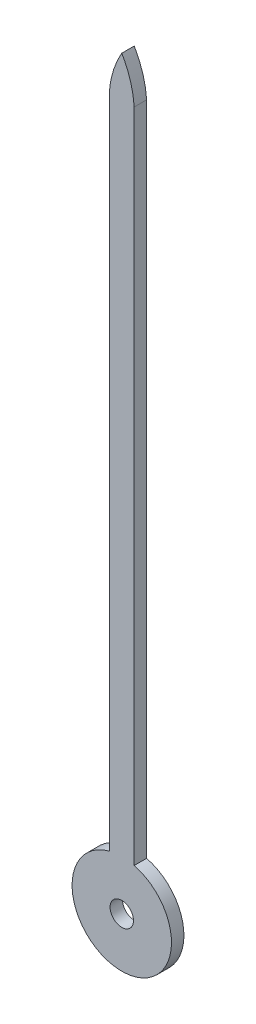
ISO-10303-21;
HEADER;
FILE_DESCRIPTION(('STEP AP214'),'2;1');
FILE_NAME('part.step','',(''),(''),'','','');
FILE_SCHEMA(('AUTOMOTIVE_DESIGN { 1 0 10303 214 1 1 1 1 }'));
ENDSEC;
DATA;
#1=APPLICATION_CONTEXT('core data for automotive mechanical design processes');
#2=APPLICATION_PROTOCOL_DEFINITION('international standard','automotive_design',2000,#1);
#3=PRODUCT_CONTEXT('',#1,'mechanical');
#4=PRODUCT('Part','Part','',(#3));
#5=PRODUCT_RELATED_PRODUCT_CATEGORY('part','',(#4));
#6=PRODUCT_DEFINITION_FORMATION('','',#4);
#7=PRODUCT_DEFINITION_CONTEXT('part definition',#1,'design');
#8=PRODUCT_DEFINITION('design','',#6,#7);
#9=PRODUCT_DEFINITION_SHAPE('','',#8);
#10=(LENGTH_UNIT() NAMED_UNIT(*) SI_UNIT(.MILLI.,.METRE.));
#11=(NAMED_UNIT(*) PLANE_ANGLE_UNIT() SI_UNIT($,.RADIAN.));
#12=(NAMED_UNIT(*) SI_UNIT($,.STERADIAN.) SOLID_ANGLE_UNIT());
#13=UNCERTAINTY_MEASURE_WITH_UNIT(LENGTH_MEASURE(1.E-05),#10,'distance_accuracy_value','');
#14=(GEOMETRIC_REPRESENTATION_CONTEXT(3) GLOBAL_UNCERTAINTY_ASSIGNED_CONTEXT((#13)) GLOBAL_UNIT_ASSIGNED_CONTEXT((#10,
#11,#12)) REPRESENTATION_CONTEXT('',''));
#15=CARTESIAN_POINT('',(0.,0.,0.));
#16=DIRECTION('',(0.,0.,1.));
#17=DIRECTION('',(1.,0.,0.));
#18=AXIS2_PLACEMENT_3D('',#15,#16,#17);
#19=CARTESIAN_POINT('',(1.03490462559106,87.645569604283,1.5));
#20=DIRECTION('',(0.,0.,1.));
#21=DIRECTION('',(1.,0.,0.));
#22=AXIS2_PLACEMENT_3D('',#19,#20,#21);
#23=PLANE('',#22);
#24=CARTESIAN_POINT('',(1.5,85.1251432363519,1.5));
#25=CARTESIAN_POINT('',(1.31980925118211,87.72856759039,1.5));
#26=CARTESIAN_POINT('',(0.,90.,1.5));
#27=B_SPLINE_CURVE_WITH_KNOTS('',2,(#24,#25,#26),.UNSPECIFIED.,.F.,.F.,(3,3),(0.,1.),.UNSPECIFIED.);
#28=CARTESIAN_POINT('',(1.5,85.1251432363519,1.5));
#29=VERTEX_POINT('',#28);
#30=CARTESIAN_POINT('',(0.,90.,1.5));
#31=VERTEX_POINT('',#30);
#32=EDGE_CURVE('E144',#29,#31,#27,.T.);
#33=ORIENTED_EDGE('',*,*,#32,.T.);
#34=CARTESIAN_POINT('',(0.,90.,1.5));
#35=CARTESIAN_POINT('',(-1.31980925118211,87.72856759039,1.5));
#36=CARTESIAN_POINT('',(-1.5,85.1251432363519,1.5));
#37=B_SPLINE_CURVE_WITH_KNOTS('',2,(#34,#35,#36),.UNSPECIFIED.,.F.,.F.,(3,3),(0.,1.),.UNSPECIFIED.);
#38=CARTESIAN_POINT('',(-1.5,85.1251432363519,1.5));
#39=VERTEX_POINT('',#38);
#40=EDGE_CURVE('E92',#31,#39,#37,.T.);
#41=ORIENTED_EDGE('',*,*,#40,.T.);
#42=DIRECTION('',(0.,-1.,0.));
#43=VECTOR('',#42,1.);
#44=CARTESIAN_POINT('',(-1.5,85.1251432363519,1.5));
#45=LINE('',#44,#43);
#46=CARTESIAN_POINT('',(-1.5,5.80947501931112,1.5));
#47=VERTEX_POINT('',#46);
#48=EDGE_CURVE('E96',#39,#47,#45,.T.);
#49=ORIENTED_EDGE('',*,*,#48,.T.);
#50=CARTESIAN_POINT('',(0.,0.,1.5));
#51=DIRECTION('',(0.,0.,1.));
#52=DIRECTION('',(1.,0.,0.));
#53=AXIS2_PLACEMENT_3D('',#50,#51,#52);
#54=CIRCLE('',#53,6.);
#55=CARTESIAN_POINT('',(1.5,5.80947501931112,1.5));
#56=VERTEX_POINT('',#55);
#57=EDGE_CURVE('E100',#47,#56,#54,.T.);
#58=ORIENTED_EDGE('',*,*,#57,.T.);
#59=DIRECTION('',(0.,1.,0.));
#60=VECTOR('',#59,1.);
#61=CARTESIAN_POINT('',(1.5,85.1251432363519,1.5));
#62=LINE('',#61,#60);
#63=EDGE_CURVE('E58',#56,#29,#62,.T.);
#64=ORIENTED_EDGE('',*,*,#63,.T.);
#65=EDGE_LOOP('',(#33,#41,#49,#58,#64));
#66=FACE_BOUND('',#65,.T.);
#67=CARTESIAN_POINT('',(0.,0.,1.5));
#68=DIRECTION('',(0.,0.,1.));
#69=DIRECTION('',(1.,0.,0.));
#70=AXIS2_PLACEMENT_3D('',#67,#68,#69);
#71=CIRCLE('',#70,1.4124600893886);
#72=CARTESIAN_POINT('',(1.4124600893886,0.,1.5));
#73=VERTEX_POINT('',#72);
#74=EDGE_CURVE('E127',#73,#73,#71,.T.);
#75=ORIENTED_EDGE('',*,*,#74,.F.);
#76=EDGE_LOOP('',(#75));
#77=FACE_BOUND('',#76,.T.);
#78=ADVANCED_FACE('F39',(#66,#77),#23,.T.);
#79=CARTESIAN_POINT('',(1.03490462559106,87.645569604283,0.));
#80=DIRECTION('',(0.,0.,1.));
#81=DIRECTION('',(1.,0.,0.));
#82=AXIS2_PLACEMENT_3D('',#79,#80,#81);
#83=PLANE('',#82);
#84=CARTESIAN_POINT('',(1.5,85.1251432363519,0.));
#85=CARTESIAN_POINT('',(1.31980925118211,87.72856759039,0.));
#86=CARTESIAN_POINT('',(0.,90.,0.));
#87=B_SPLINE_CURVE_WITH_KNOTS('',2,(#84,#85,#86),.UNSPECIFIED.,.F.,.F.,(3,3),(0.,1.),.UNSPECIFIED.);
#88=CARTESIAN_POINT('',(1.5,85.1251432363519,0.));
#89=VERTEX_POINT('',#88);
#90=CARTESIAN_POINT('',(0.,90.,0.));
#91=VERTEX_POINT('',#90);
#92=EDGE_CURVE('E120',#89,#91,#87,.T.);
#93=ORIENTED_EDGE('',*,*,#92,.F.);
#94=DIRECTION('',(0.,1.,0.));
#95=VECTOR('',#94,1.);
#96=CARTESIAN_POINT('',(1.5,85.1251432363519,0.));
#97=LINE('',#96,#95);
#98=CARTESIAN_POINT('',(1.5,5.80947501931112,0.));
#99=VERTEX_POINT('',#98);
#100=EDGE_CURVE('E84',#99,#89,#97,.T.);
#101=ORIENTED_EDGE('',*,*,#100,.F.);
#102=CARTESIAN_POINT('',(0.,0.,0.));
#103=DIRECTION('',(0.,0.,1.));
#104=DIRECTION('',(1.,0.,0.));
#105=AXIS2_PLACEMENT_3D('',#102,#103,#104);
#106=CIRCLE('',#105,6.);
#107=CARTESIAN_POINT('',(-1.5,5.80947501931112,0.));
#108=VERTEX_POINT('',#107);
#109=EDGE_CURVE('E78',#108,#99,#106,.T.);
#110=ORIENTED_EDGE('',*,*,#109,.F.);
#111=DIRECTION('',(0.,-1.,0.));
#112=VECTOR('',#111,1.);
#113=CARTESIAN_POINT('',(-1.5,85.1251432363519,0.));
#114=LINE('',#113,#112);
#115=CARTESIAN_POINT('',(-1.5,85.1251432363519,0.));
#116=VERTEX_POINT('',#115);
#117=EDGE_CURVE('E108',#116,#108,#114,.T.);
#118=ORIENTED_EDGE('',*,*,#117,.F.);
#119=CARTESIAN_POINT('',(0.,90.,0.));
#120=CARTESIAN_POINT('',(-1.31980925118211,87.72856759039,0.));
#121=CARTESIAN_POINT('',(-1.5,85.1251432363519,0.));
#122=B_SPLINE_CURVE_WITH_KNOTS('',2,(#119,#120,#121),.UNSPECIFIED.,.F.,.F.,(3,3),(0.,1.),.UNSPECIFIED.);
#123=EDGE_CURVE('E126',#91,#116,#122,.T.);
#124=ORIENTED_EDGE('',*,*,#123,.F.);
#125=EDGE_LOOP('',(#93,#101,#110,#118,#124));
#126=FACE_BOUND('',#125,.T.);
#127=CARTESIAN_POINT('',(0.,0.,0.));
#128=DIRECTION('',(0.,0.,1.));
#129=DIRECTION('',(1.,0.,0.));
#130=AXIS2_PLACEMENT_3D('',#127,#128,#129);
#131=CIRCLE('',#130,1.4124600893886);
#132=CARTESIAN_POINT('',(1.4124600893886,0.,0.));
#133=VERTEX_POINT('',#132);
#134=EDGE_CURVE('E196',#133,#133,#131,.T.);
#135=ORIENTED_EDGE('',*,*,#134,.T.);
#136=EDGE_LOOP('',(#135));
#137=FACE_BOUND('',#136,.T.);
#138=ADVANCED_FACE('F151',(#126,#137),#83,.F.);
#139=DIRECTION('',(0.,0.,-1.));
#140=VECTOR('',#139,1.);
#141=SURFACE_OF_LINEAR_EXTRUSION('',#27,#140);
#142=ORIENTED_EDGE('',*,*,#92,.T.);
#143=DIRECTION('',(0.,0.,-1.));
#144=VECTOR('',#143,1.);
#145=CARTESIAN_POINT('',(0.,90.,1.5));
#146=LINE('',#145,#144);
#147=EDGE_CURVE('E11',#31,#91,#146,.T.);
#148=ORIENTED_EDGE('',*,*,#147,.F.);
#149=ORIENTED_EDGE('',*,*,#32,.F.);
#150=DIRECTION('',(0.,0.,-1.));
#151=VECTOR('',#150,1.);
#152=CARTESIAN_POINT('',(1.5,85.1251432363519,1.5));
#153=LINE('',#152,#151);
#154=EDGE_CURVE('E116',#29,#89,#153,.T.);
#155=ORIENTED_EDGE('',*,*,#154,.T.);
#156=EDGE_LOOP('',(#142,#148,#149,#155));
#157=FACE_BOUND('',#156,.T.);
#158=ADVANCED_FACE('F41',(#157),#141,.F.);
#159=DIRECTION('',(0.,0.,-1.));
#160=VECTOR('',#159,1.);
#161=SURFACE_OF_LINEAR_EXTRUSION('',#37,#160);
#162=ORIENTED_EDGE('',*,*,#123,.T.);
#163=DIRECTION('',(0.,0.,-1.));
#164=VECTOR('',#163,1.);
#165=CARTESIAN_POINT('',(-1.5,85.1251432363519,1.5));
#166=LINE('',#165,#164);
#167=EDGE_CURVE('E50',#39,#116,#166,.T.);
#168=ORIENTED_EDGE('',*,*,#167,.F.);
#169=ORIENTED_EDGE('',*,*,#40,.F.);
#170=ORIENTED_EDGE('',*,*,#147,.T.);
#171=EDGE_LOOP('',(#162,#168,#169,#170));
#172=FACE_BOUND('',#171,.T.);
#173=ADVANCED_FACE('F176',(#172),#161,.F.);
#174=CARTESIAN_POINT('',(-1.5,85.1251432363519,1.5));
#175=DIRECTION('',(1.,0.,0.));
#176=DIRECTION('',(0.,0.,-1.));
#177=AXIS2_PLACEMENT_3D('',#174,#175,#176);
#178=PLANE('',#177);
#179=ORIENTED_EDGE('',*,*,#117,.T.);
#180=DIRECTION('',(0.,0.,-1.));
#181=VECTOR('',#180,1.);
#182=CARTESIAN_POINT('',(-1.5,5.80947501931112,1.5));
#183=LINE('',#182,#181);
#184=EDGE_CURVE('E105',#47,#108,#183,.T.);
#185=ORIENTED_EDGE('',*,*,#184,.F.);
#186=ORIENTED_EDGE('',*,*,#48,.F.);
#187=ORIENTED_EDGE('',*,*,#167,.T.);
#188=EDGE_LOOP('',(#179,#185,#186,#187));
#189=FACE_BOUND('',#188,.T.);
#190=ADVANCED_FACE('F106',(#189),#178,.F.);
#191=CARTESIAN_POINT('',(0.,0.,1.5));
#192=DIRECTION('',(0.,0.,-1.));
#193=DIRECTION('',(-1.,0.,0.));
#194=AXIS2_PLACEMENT_3D('',#191,#192,#193);
#195=CYLINDRICAL_SURFACE('',#194,6.);
#196=ORIENTED_EDGE('',*,*,#109,.T.);
#197=DIRECTION('',(0.,0.,-1.));
#198=VECTOR('',#197,1.);
#199=CARTESIAN_POINT('',(1.5,5.80947501931112,1.5));
#200=LINE('',#199,#198);
#201=EDGE_CURVE('E110',#56,#99,#200,.T.);
#202=ORIENTED_EDGE('',*,*,#201,.F.);
#203=ORIENTED_EDGE('',*,*,#57,.F.);
#204=ORIENTED_EDGE('',*,*,#184,.T.);
#205=EDGE_LOOP('',(#196,#202,#203,#204));
#206=FACE_BOUND('',#205,.T.);
#207=ADVANCED_FACE('F112',(#206),#195,.T.);
#208=CARTESIAN_POINT('',(1.5,85.1251432363519,1.5));
#209=DIRECTION('',(-1.,0.,0.));
#210=DIRECTION('',(0.,0.,1.));
#211=AXIS2_PLACEMENT_3D('',#208,#209,#210);
#212=PLANE('',#211);
#213=ORIENTED_EDGE('',*,*,#100,.T.);
#214=ORIENTED_EDGE('',*,*,#154,.F.);
#215=ORIENTED_EDGE('',*,*,#63,.F.);
#216=ORIENTED_EDGE('',*,*,#201,.T.);
#217=EDGE_LOOP('',(#213,#214,#215,#216));
#218=FACE_BOUND('',#217,.T.);
#219=ADVANCED_FACE('F156',(#218),#212,.F.);
#220=CARTESIAN_POINT('',(0.,0.,1.5));
#221=DIRECTION('',(0.,0.,-1.));
#222=DIRECTION('',(-1.,0.,0.));
#223=AXIS2_PLACEMENT_3D('',#220,#221,#222);
#224=CYLINDRICAL_SURFACE('',#223,1.4124600893886);
#225=ORIENTED_EDGE('',*,*,#74,.T.);
#226=EDGE_LOOP('',(#225));
#227=FACE_BOUND('',#226,.T.);
#228=ORIENTED_EDGE('',*,*,#134,.F.);
#229=EDGE_LOOP('',(#228));
#230=FACE_BOUND('',#229,.T.);
#231=ADVANCED_FACE('F158',(#227,#230),#224,.F.);
#232=CLOSED_SHELL('',(#78,#138,#158,#173,#190,#207,#219,#231));
#233=MANIFOLD_SOLID_BREP('B2',#232);
#234=ADVANCED_BREP_SHAPE_REPRESENTATION('',(#18,#233),#14);
#235=SHAPE_DEFINITION_REPRESENTATION(#9,#234);
ENDSEC;
END-ISO-10303-21;
